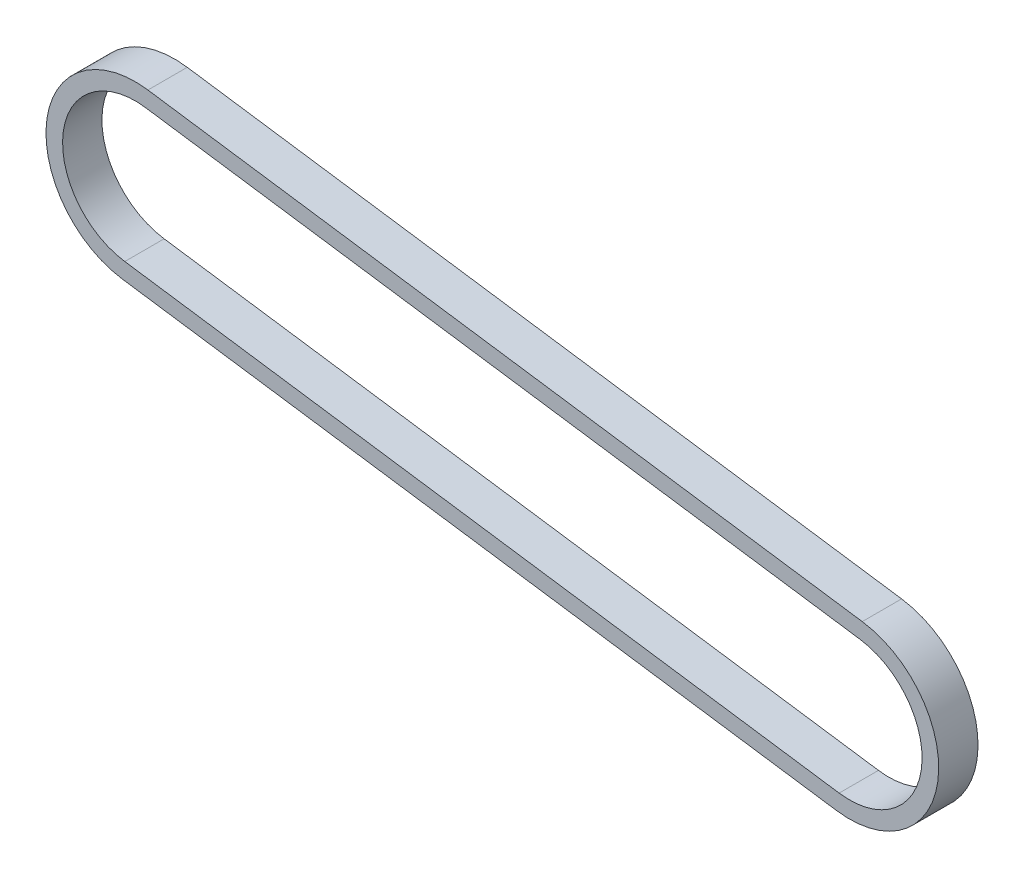
ISO-10303-21;
HEADER;
FILE_DESCRIPTION(('STEP AP214'),'2;1');
FILE_NAME('part.step','',(''),(''),'','','');
FILE_SCHEMA(('AUTOMOTIVE_DESIGN { 1 0 10303 214 1 1 1 1 }'));
ENDSEC;
DATA;
#1=APPLICATION_CONTEXT('core data for automotive mechanical design processes');
#2=APPLICATION_PROTOCOL_DEFINITION('international standard','automotive_design',2000,#1);
#3=PRODUCT_CONTEXT('',#1,'mechanical');
#4=PRODUCT('Part','Part','',(#3));
#5=PRODUCT_RELATED_PRODUCT_CATEGORY('part','',(#4));
#6=PRODUCT_DEFINITION_FORMATION('','',#4);
#7=PRODUCT_DEFINITION_CONTEXT('part definition',#1,'design');
#8=PRODUCT_DEFINITION('design','',#6,#7);
#9=PRODUCT_DEFINITION_SHAPE('','',#8);
#10=(LENGTH_UNIT() NAMED_UNIT(*) SI_UNIT(.MILLI.,.METRE.));
#11=(NAMED_UNIT(*) PLANE_ANGLE_UNIT() SI_UNIT($,.RADIAN.));
#12=(NAMED_UNIT(*) SI_UNIT($,.STERADIAN.) SOLID_ANGLE_UNIT());
#13=UNCERTAINTY_MEASURE_WITH_UNIT(LENGTH_MEASURE(1.E-05),#10,'distance_accuracy_value','');
#14=(GEOMETRIC_REPRESENTATION_CONTEXT(3) GLOBAL_UNCERTAINTY_ASSIGNED_CONTEXT((#13)) GLOBAL_UNIT_ASSIGNED_CONTEXT((#10,
#11,#12)) REPRESENTATION_CONTEXT('',''));
#15=CARTESIAN_POINT('',(0.,0.,0.));
#16=DIRECTION('',(0.,0.,1.));
#17=DIRECTION('',(1.,0.,0.));
#18=AXIS2_PLACEMENT_3D('',#15,#16,#17);
#19=CARTESIAN_POINT('',(-74.3353576048452,10.7380625845822,-4.5));
#20=DIRECTION('',(0.,0.,-1.));
#21=DIRECTION('',(-1.,0.,0.));
#22=AXIS2_PLACEMENT_3D('',#19,#20,#21);
#23=PLANE('',#22);
#24=CARTESIAN_POINT('',(-74.3353576048452,10.7380625845822,-4.5));
#25=DIRECTION('',(0.,0.,-1.));
#26=DIRECTION('',(-1.,0.,0.));
#27=AXIS2_PLACEMENT_3D('',#24,#25,#26);
#28=CIRCLE('',#27,20.4);
#29=CARTESIAN_POINT('',(-77.251952226661,-9.45236771821214,-4.5));
#30=VERTEX_POINT('',#29);
#31=CARTESIAN_POINT('',(-71.4187629830293,30.9284928873765,-4.5));
#32=VERTEX_POINT('',#31);
#33=EDGE_CURVE('E133',#30,#32,#28,.T.);
#34=ORIENTED_EDGE('',*,*,#33,.T.);
#35=DIRECTION('',(0.989726975627172,-0.142970324598817,0.));
#36=VECTOR('',#35,1.);
#37=CARTESIAN_POINT('',(-71.4187629830293,30.9284928873765,-4.5));
#38=LINE('',#37,#36);
#39=CARTESIAN_POINT('',(91.9851606930168,7.32409229611188,-4.5));
#40=VERTEX_POINT('',#39);
#41=EDGE_CURVE('E136',#32,#40,#38,.T.);
#42=ORIENTED_EDGE('',*,*,#41,.T.);
#43=CARTESIAN_POINT('',(89.0685660712009,-12.8663380066824,-4.5));
#44=DIRECTION('',(0.,0.,-1.));
#45=DIRECTION('',(-1.,0.,0.));
#46=AXIS2_PLACEMENT_3D('',#43,#44,#45);
#47=CIRCLE('',#46,20.4);
#48=CARTESIAN_POINT('',(86.151971449385,-33.0567683094767,-4.5));
#49=VERTEX_POINT('',#48);
#50=EDGE_CURVE('E139',#40,#49,#47,.T.);
#51=ORIENTED_EDGE('',*,*,#50,.T.);
#52=DIRECTION('',(-0.989726975627172,0.142970324598817,0.));
#53=VECTOR('',#52,1.);
#54=CARTESIAN_POINT('',(-77.251952226661,-9.45236771821214,-4.5));
#55=LINE('',#54,#53);
#56=EDGE_CURVE('E141',#49,#30,#55,.T.);
#57=ORIENTED_EDGE('',*,*,#56,.T.);
#58=EDGE_LOOP('',(#34,#42,#51,#57));
#59=FACE_BOUND('',#58,.T.);
#60=DIRECTION('',(0.989726975627172,-0.142970324598817,0.));
#61=VECTOR('',#60,1.);
#62=CARTESIAN_POINT('',(-71.9620502165048,27.1675303799932,-4.5));
#63=LINE('',#62,#61);
#64=CARTESIAN_POINT('',(-71.9620502165048,27.1675303799932,-4.5));
#65=VERTEX_POINT('',#64);
#66=CARTESIAN_POINT('',(91.4418734595413,3.56312978872862,-4.5));
#67=VERTEX_POINT('',#66);
#68=EDGE_CURVE('E105',#65,#67,#63,.T.);
#69=ORIENTED_EDGE('',*,*,#68,.F.);
#70=CARTESIAN_POINT('',(-74.3353576048452,10.7380625845822,-4.5));
#71=DIRECTION('',(0.,0.,-1.));
#72=DIRECTION('',(-1.,0.,0.));
#73=AXIS2_PLACEMENT_3D('',#70,#71,#72);
#74=CIRCLE('',#73,16.6);
#75=CARTESIAN_POINT('',(-76.7086649931855,-5.69140521082889,-4.5));
#76=VERTEX_POINT('',#75);
#77=EDGE_CURVE('E97',#76,#65,#74,.T.);
#78=ORIENTED_EDGE('',*,*,#77,.F.);
#79=DIRECTION('',(-0.989726975627172,0.142970324598817,0.));
#80=VECTOR('',#79,1.);
#81=CARTESIAN_POINT('',(-76.7086649931855,-5.69140521082889,-4.5));
#82=LINE('',#81,#80);
#83=CARTESIAN_POINT('',(86.6952586828605,-29.2958058020935,-4.5));
#84=VERTEX_POINT('',#83);
#85=EDGE_CURVE('E119',#84,#76,#82,.T.);
#86=ORIENTED_EDGE('',*,*,#85,.F.);
#87=CARTESIAN_POINT('',(89.0685660712009,-12.8663380066824,-4.5));
#88=DIRECTION('',(0.,0.,-1.));
#89=DIRECTION('',(-1.,0.,0.));
#90=AXIS2_PLACEMENT_3D('',#87,#88,#89);
#91=CIRCLE('',#90,16.6);
#92=EDGE_CURVE('E117',#67,#84,#91,.T.);
#93=ORIENTED_EDGE('',*,*,#92,.F.);
#94=EDGE_LOOP('',(#69,#78,#86,#93));
#95=FACE_BOUND('',#94,.T.);
#96=ADVANCED_FACE('F32',(#59,#95),#23,.T.);
#97=CARTESIAN_POINT('',(-74.3353576048452,10.7380625845822,4.5));
#98=DIRECTION('',(0.,0.,-1.));
#99=DIRECTION('',(-1.,0.,0.));
#100=AXIS2_PLACEMENT_3D('',#97,#98,#99);
#101=PLANE('',#100);
#102=CARTESIAN_POINT('',(-74.3353576048452,10.7380625845822,4.5));
#103=DIRECTION('',(0.,0.,-1.));
#104=DIRECTION('',(-1.,0.,0.));
#105=AXIS2_PLACEMENT_3D('',#102,#103,#104);
#106=CIRCLE('',#105,20.4);
#107=CARTESIAN_POINT('',(-77.251952226661,-9.45236771821214,4.5));
#108=VERTEX_POINT('',#107);
#109=CARTESIAN_POINT('',(-71.4187629830293,30.9284928873765,4.5));
#110=VERTEX_POINT('',#109);
#111=EDGE_CURVE('E113',#108,#110,#106,.T.);
#112=ORIENTED_EDGE('',*,*,#111,.F.);
#113=DIRECTION('',(-0.989726975627172,0.142970324598817,0.));
#114=VECTOR('',#113,1.);
#115=CARTESIAN_POINT('',(-77.251952226661,-9.45236771821214,4.5));
#116=LINE('',#115,#114);
#117=CARTESIAN_POINT('',(86.151971449385,-33.0567683094767,4.5));
#118=VERTEX_POINT('',#117);
#119=EDGE_CURVE('E137',#118,#108,#116,.T.);
#120=ORIENTED_EDGE('',*,*,#119,.F.);
#121=CARTESIAN_POINT('',(89.0685660712009,-12.8663380066824,4.5));
#122=DIRECTION('',(0.,0.,-1.));
#123=DIRECTION('',(-1.,0.,0.));
#124=AXIS2_PLACEMENT_3D('',#121,#122,#123);
#125=CIRCLE('',#124,20.4);
#126=CARTESIAN_POINT('',(91.9851606930168,7.32409229611188,4.5));
#127=VERTEX_POINT('',#126);
#128=EDGE_CURVE('E148',#127,#118,#125,.T.);
#129=ORIENTED_EDGE('',*,*,#128,.F.);
#130=DIRECTION('',(0.989726975627172,-0.142970324598817,0.));
#131=VECTOR('',#130,1.);
#132=CARTESIAN_POINT('',(-71.4187629830293,30.9284928873765,4.5));
#133=LINE('',#132,#131);
#134=EDGE_CURVE('E146',#110,#127,#133,.T.);
#135=ORIENTED_EDGE('',*,*,#134,.F.);
#136=EDGE_LOOP('',(#112,#120,#129,#135));
#137=FACE_BOUND('',#136,.T.);
#138=CARTESIAN_POINT('',(-74.3353576048452,10.7380625845822,4.5));
#139=DIRECTION('',(0.,0.,-1.));
#140=DIRECTION('',(-1.,0.,0.));
#141=AXIS2_PLACEMENT_3D('',#138,#139,#140);
#142=CIRCLE('',#141,16.6);
#143=CARTESIAN_POINT('',(-76.7086649931855,-5.69140521082888,4.5));
#144=VERTEX_POINT('',#143);
#145=CARTESIAN_POINT('',(-71.9620502165048,27.1675303799932,4.5));
#146=VERTEX_POINT('',#145);
#147=EDGE_CURVE('E55',#144,#146,#142,.T.);
#148=ORIENTED_EDGE('',*,*,#147,.T.);
#149=DIRECTION('',(0.989726975627172,-0.142970324598817,0.));
#150=VECTOR('',#149,1.);
#151=CARTESIAN_POINT('',(-71.9620502165048,27.1675303799932,4.5));
#152=LINE('',#151,#150);
#153=CARTESIAN_POINT('',(91.4418734595413,3.56312978872862,4.5));
#154=VERTEX_POINT('',#153);
#155=EDGE_CURVE('E112',#146,#154,#152,.T.);
#156=ORIENTED_EDGE('',*,*,#155,.T.);
#157=CARTESIAN_POINT('',(89.0685660712009,-12.8663380066824,4.5));
#158=DIRECTION('',(0.,0.,-1.));
#159=DIRECTION('',(-1.,0.,0.));
#160=AXIS2_PLACEMENT_3D('',#157,#158,#159);
#161=CIRCLE('',#160,16.6);
#162=CARTESIAN_POINT('',(86.6952586828605,-29.2958058020935,4.5));
#163=VERTEX_POINT('',#162);
#164=EDGE_CURVE('E125',#154,#163,#161,.T.);
#165=ORIENTED_EDGE('',*,*,#164,.T.);
#166=DIRECTION('',(-0.989726975627172,0.142970324598817,0.));
#167=VECTOR('',#166,1.);
#168=CARTESIAN_POINT('',(-76.7086649931855,-5.69140521082889,4.5));
#169=LINE('',#168,#167);
#170=EDGE_CURVE('E106',#163,#144,#169,.T.);
#171=ORIENTED_EDGE('',*,*,#170,.T.);
#172=EDGE_LOOP('',(#148,#156,#165,#171));
#173=FACE_BOUND('',#172,.T.);
#174=ADVANCED_FACE('F166',(#137,#173),#101,.F.);
#175=CARTESIAN_POINT('',(-74.3353576048452,10.7380625845822,-4.5));
#176=DIRECTION('',(0.,0.,1.));
#177=DIRECTION('',(1.,0.,0.));
#178=AXIS2_PLACEMENT_3D('',#175,#176,#177);
#179=CYLINDRICAL_SURFACE('',#178,20.4);
#180=ORIENTED_EDGE('',*,*,#111,.T.);
#181=DIRECTION('',(0.,0.,1.));
#182=VECTOR('',#181,1.);
#183=CARTESIAN_POINT('',(-71.4187629830293,30.9284928873765,-4.5));
#184=LINE('',#183,#182);
#185=EDGE_CURVE('E11',#32,#110,#184,.T.);
#186=ORIENTED_EDGE('',*,*,#185,.F.);
#187=ORIENTED_EDGE('',*,*,#33,.F.);
#188=DIRECTION('',(0.,0.,1.));
#189=VECTOR('',#188,1.);
#190=CARTESIAN_POINT('',(-77.251952226661,-9.45236771821214,-4.5));
#191=LINE('',#190,#189);
#192=EDGE_CURVE('E143',#30,#108,#191,.T.);
#193=ORIENTED_EDGE('',*,*,#192,.T.);
#194=EDGE_LOOP('',(#180,#186,#187,#193));
#195=FACE_BOUND('',#194,.T.);
#196=ADVANCED_FACE('F34',(#195),#179,.T.);
#197=CARTESIAN_POINT('',(-71.4187629830293,30.9284928873765,-4.5));
#198=DIRECTION('',(-0.142970324598817,-0.989726975627172,0.));
#199=DIRECTION('',(0.989726975627172,-0.142970324598817,0.));
#200=AXIS2_PLACEMENT_3D('',#197,#198,#199);
#201=PLANE('',#200);
#202=ORIENTED_EDGE('',*,*,#134,.T.);
#203=DIRECTION('',(0.,0.,1.));
#204=VECTOR('',#203,1.);
#205=CARTESIAN_POINT('',(91.9851606930168,7.32409229611188,-4.5));
#206=LINE('',#205,#204);
#207=EDGE_CURVE('E40',#40,#127,#206,.T.);
#208=ORIENTED_EDGE('',*,*,#207,.F.);
#209=ORIENTED_EDGE('',*,*,#41,.F.);
#210=ORIENTED_EDGE('',*,*,#185,.T.);
#211=EDGE_LOOP('',(#202,#208,#209,#210));
#212=FACE_BOUND('',#211,.T.);
#213=ADVANCED_FACE('F176',(#212),#201,.F.);
#214=CARTESIAN_POINT('',(89.0685660712009,-12.8663380066824,-4.5));
#215=DIRECTION('',(0.,0.,1.));
#216=DIRECTION('',(1.,0.,0.));
#217=AXIS2_PLACEMENT_3D('',#214,#215,#216);
#218=CYLINDRICAL_SURFACE('',#217,20.4);
#219=ORIENTED_EDGE('',*,*,#128,.T.);
#220=DIRECTION('',(0.,0.,1.));
#221=VECTOR('',#220,1.);
#222=CARTESIAN_POINT('',(86.151971449385,-33.0567683094767,-4.5));
#223=LINE('',#222,#221);
#224=EDGE_CURVE('E153',#49,#118,#223,.T.);
#225=ORIENTED_EDGE('',*,*,#224,.F.);
#226=ORIENTED_EDGE('',*,*,#50,.F.);
#227=ORIENTED_EDGE('',*,*,#207,.T.);
#228=EDGE_LOOP('',(#219,#225,#226,#227));
#229=FACE_BOUND('',#228,.T.);
#230=ADVANCED_FACE('F160',(#229),#218,.T.);
#231=CARTESIAN_POINT('',(-77.251952226661,-9.45236771821214,-4.5));
#232=DIRECTION('',(0.142970324598817,0.989726975627172,0.));
#233=DIRECTION('',(-0.989726975627172,0.142970324598817,0.));
#234=AXIS2_PLACEMENT_3D('',#231,#232,#233);
#235=PLANE('',#234);
#236=ORIENTED_EDGE('',*,*,#119,.T.);
#237=ORIENTED_EDGE('',*,*,#192,.F.);
#238=ORIENTED_EDGE('',*,*,#56,.F.);
#239=ORIENTED_EDGE('',*,*,#224,.T.);
#240=EDGE_LOOP('',(#236,#237,#238,#239));
#241=FACE_BOUND('',#240,.T.);
#242=ADVANCED_FACE('F170',(#241),#235,.F.);
#243=CARTESIAN_POINT('',(-74.3353576048452,10.7380625845822,-4.5));
#244=DIRECTION('',(0.,0.,1.));
#245=DIRECTION('',(1.,0.,0.));
#246=AXIS2_PLACEMENT_3D('',#243,#244,#245);
#247=CYLINDRICAL_SURFACE('',#246,16.6);
#248=ORIENTED_EDGE('',*,*,#147,.F.);
#249=DIRECTION('',(0.,0.,1.));
#250=VECTOR('',#249,1.);
#251=CARTESIAN_POINT('',(-76.7086649931855,-5.69140521082889,-4.5));
#252=LINE('',#251,#250);
#253=EDGE_CURVE('E101',#76,#144,#252,.T.);
#254=ORIENTED_EDGE('',*,*,#253,.F.);
#255=ORIENTED_EDGE('',*,*,#77,.T.);
#256=DIRECTION('',(0.,0.,1.));
#257=VECTOR('',#256,1.);
#258=CARTESIAN_POINT('',(-71.9620502165048,27.1675303799932,-4.5));
#259=LINE('',#258,#257);
#260=EDGE_CURVE('E100',#65,#146,#259,.T.);
#261=ORIENTED_EDGE('',*,*,#260,.T.);
#262=EDGE_LOOP('',(#248,#254,#255,#261));
#263=FACE_BOUND('',#262,.T.);
#264=ADVANCED_FACE('F99',(#263),#247,.F.);
#265=CARTESIAN_POINT('',(-71.9620502165048,27.1675303799932,-4.5));
#266=DIRECTION('',(-0.142970324598817,-0.989726975627172,0.));
#267=DIRECTION('',(0.989726975627172,-0.142970324598817,0.));
#268=AXIS2_PLACEMENT_3D('',#265,#266,#267);
#269=PLANE('',#268);
#270=ORIENTED_EDGE('',*,*,#155,.F.);
#271=ORIENTED_EDGE('',*,*,#260,.F.);
#272=ORIENTED_EDGE('',*,*,#68,.T.);
#273=DIRECTION('',(0.,0.,1.));
#274=VECTOR('',#273,1.);
#275=CARTESIAN_POINT('',(91.4418734595413,3.56312978872862,-4.5));
#276=LINE('',#275,#274);
#277=EDGE_CURVE('E114',#67,#154,#276,.T.);
#278=ORIENTED_EDGE('',*,*,#277,.T.);
#279=EDGE_LOOP('',(#270,#271,#272,#278));
#280=FACE_BOUND('',#279,.T.);
#281=ADVANCED_FACE('F109',(#280),#269,.T.);
#282=CARTESIAN_POINT('',(89.0685660712009,-12.8663380066824,-4.5));
#283=DIRECTION('',(0.,0.,1.));
#284=DIRECTION('',(1.,0.,0.));
#285=AXIS2_PLACEMENT_3D('',#282,#283,#284);
#286=CYLINDRICAL_SURFACE('',#285,16.6);
#287=ORIENTED_EDGE('',*,*,#164,.F.);
#288=ORIENTED_EDGE('',*,*,#277,.F.);
#289=ORIENTED_EDGE('',*,*,#92,.T.);
#290=DIRECTION('',(0.,0.,1.));
#291=VECTOR('',#290,1.);
#292=CARTESIAN_POINT('',(86.6952586828605,-29.2958058020935,-4.5));
#293=LINE('',#292,#291);
#294=EDGE_CURVE('E47',#84,#163,#293,.T.);
#295=ORIENTED_EDGE('',*,*,#294,.T.);
#296=EDGE_LOOP('',(#287,#288,#289,#295));
#297=FACE_BOUND('',#296,.T.);
#298=ADVANCED_FACE('F199',(#297),#286,.F.);
#299=CARTESIAN_POINT('',(-76.7086649931855,-5.69140521082889,-4.5));
#300=DIRECTION('',(0.142970324598817,0.989726975627172,0.));
#301=DIRECTION('',(-0.989726975627172,0.142970324598817,0.));
#302=AXIS2_PLACEMENT_3D('',#299,#300,#301);
#303=PLANE('',#302);
#304=ORIENTED_EDGE('',*,*,#170,.F.);
#305=ORIENTED_EDGE('',*,*,#294,.F.);
#306=ORIENTED_EDGE('',*,*,#85,.T.);
#307=ORIENTED_EDGE('',*,*,#253,.T.);
#308=EDGE_LOOP('',(#304,#305,#306,#307));
#309=FACE_BOUND('',#308,.T.);
#310=ADVANCED_FACE('F203',(#309),#303,.T.);
#311=CLOSED_SHELL('',(#96,#174,#196,#213,#230,#242,#264,#281,#298,#310));
#312=MANIFOLD_SOLID_BREP('B2',#311);
#313=ADVANCED_BREP_SHAPE_REPRESENTATION('',(#18,#312),#14);
#314=SHAPE_DEFINITION_REPRESENTATION(#9,#313);
ENDSEC;
END-ISO-10303-21;
